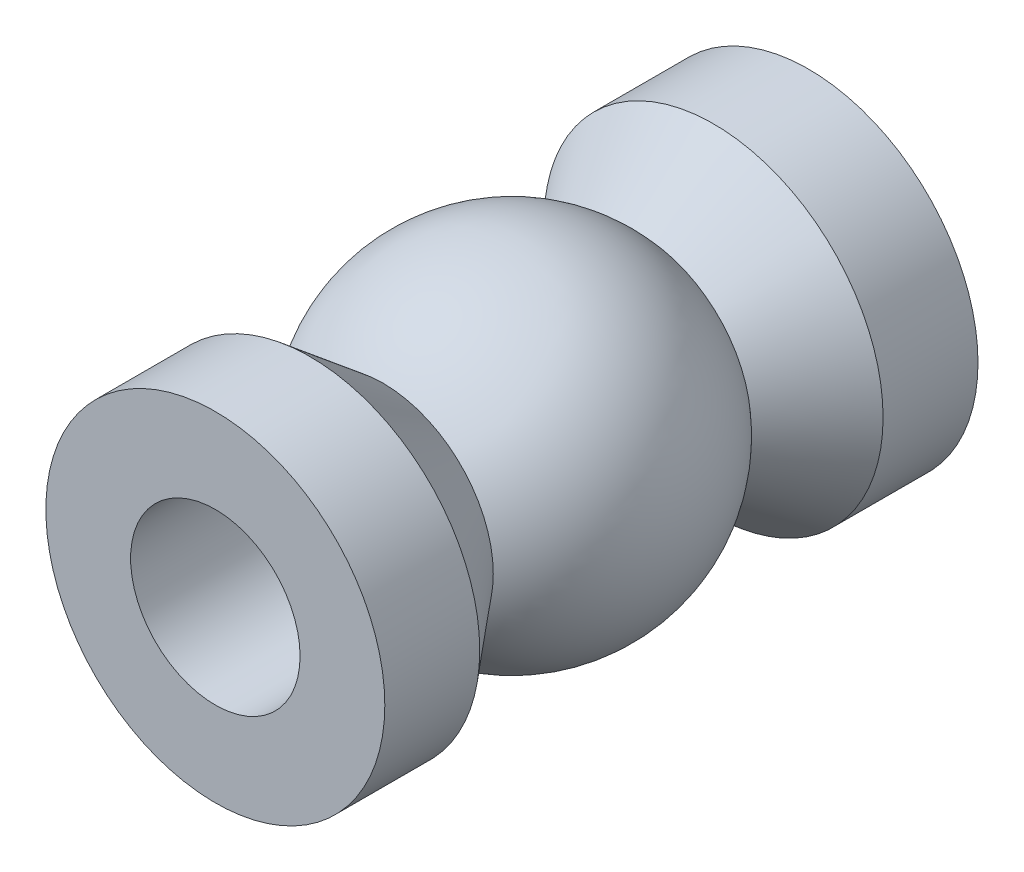
ISO-10303-21;
HEADER;
FILE_DESCRIPTION(('STEP AP214'),'2;1');
FILE_NAME('part.step','',(''),(''),'','','');
FILE_SCHEMA(('AUTOMOTIVE_DESIGN { 1 0 10303 214 1 1 1 1 }'));
ENDSEC;
DATA;
#1=APPLICATION_CONTEXT('core data for automotive mechanical design processes');
#2=APPLICATION_PROTOCOL_DEFINITION('international standard','automotive_design',2000,#1);
#3=PRODUCT_CONTEXT('',#1,'mechanical');
#4=PRODUCT('Part','Part','',(#3));
#5=PRODUCT_RELATED_PRODUCT_CATEGORY('part','',(#4));
#6=PRODUCT_DEFINITION_FORMATION('','',#4);
#7=PRODUCT_DEFINITION_CONTEXT('part definition',#1,'design');
#8=PRODUCT_DEFINITION('design','',#6,#7);
#9=PRODUCT_DEFINITION_SHAPE('','',#8);
#10=(LENGTH_UNIT() NAMED_UNIT(*) SI_UNIT(.MILLI.,.METRE.));
#11=(NAMED_UNIT(*) PLANE_ANGLE_UNIT() SI_UNIT($,.RADIAN.));
#12=(NAMED_UNIT(*) SI_UNIT($,.STERADIAN.) SOLID_ANGLE_UNIT());
#13=UNCERTAINTY_MEASURE_WITH_UNIT(LENGTH_MEASURE(1.E-05),#10,'distance_accuracy_value','');
#14=(GEOMETRIC_REPRESENTATION_CONTEXT(3) GLOBAL_UNCERTAINTY_ASSIGNED_CONTEXT((#13)) GLOBAL_UNIT_ASSIGNED_CONTEXT((#10,
#11,#12)) REPRESENTATION_CONTEXT('',''));
#15=CARTESIAN_POINT('',(0.,0.,0.));
#16=DIRECTION('',(0.,0.,1.));
#17=DIRECTION('',(1.,0.,0.));
#18=AXIS2_PLACEMENT_3D('',#15,#16,#17);
#19=CARTESIAN_POINT('',(0.,-3.175,11.1125));
#20=DIRECTION('',(0.,0.,1.));
#21=DIRECTION('',(1.,0.,0.));
#22=AXIS2_PLACEMENT_3D('',#19,#20,#21);
#23=PLANE('',#22);
#24=CARTESIAN_POINT('',(0.,0.,11.1125));
#25=DIRECTION('',(0.,0.,1.));
#26=DIRECTION('',(1.,0.,0.));
#27=AXIS2_PLACEMENT_3D('',#24,#25,#26);
#28=CIRCLE('',#27,6.35);
#29=CARTESIAN_POINT('',(6.35,0.,11.1125));
#30=VERTEX_POINT('',#29);
#31=EDGE_CURVE('E11',#30,#30,#28,.T.);
#32=ORIENTED_EDGE('',*,*,#31,.T.);
#33=EDGE_LOOP('',(#32));
#34=FACE_BOUND('',#33,.T.);
#35=CARTESIAN_POINT('',(0.,0.,11.1125));
#36=DIRECTION('',(0.,0.,1.));
#37=DIRECTION('',(1.,0.,0.));
#38=AXIS2_PLACEMENT_3D('',#35,#36,#37);
#39=CIRCLE('',#38,3.175);
#40=CARTESIAN_POINT('',(3.175,0.,11.1125));
#41=VERTEX_POINT('',#40);
#42=EDGE_CURVE('E67',#41,#41,#39,.T.);
#43=ORIENTED_EDGE('',*,*,#42,.F.);
#44=EDGE_LOOP('',(#43));
#45=FACE_BOUND('',#44,.T.);
#46=ADVANCED_FACE('F39',(#34,#45),#23,.T.);
#47=CARTESIAN_POINT('',(0.,0.,-0.0693447737909496));
#48=DIRECTION('',(0.,0.,1.));
#49=DIRECTION('',(1.,0.,0.));
#50=AXIS2_PLACEMENT_3D('',#47,#48,#49);
#51=CYLINDRICAL_SURFACE('',#50,6.35);
#52=CARTESIAN_POINT('',(0.,0.,7.5565));
#53=DIRECTION('',(0.,0.,1.));
#54=DIRECTION('',(1.,0.,0.));
#55=AXIS2_PLACEMENT_3D('',#52,#53,#54);
#56=CIRCLE('',#55,6.35);
#57=CARTESIAN_POINT('',(6.35,0.,7.5565));
#58=VERTEX_POINT('',#57);
#59=EDGE_CURVE('E44',#58,#58,#56,.T.);
#60=ORIENTED_EDGE('',*,*,#59,.T.);
#61=EDGE_LOOP('',(#60));
#62=FACE_BOUND('',#61,.T.);
#63=ORIENTED_EDGE('',*,*,#31,.F.);
#64=EDGE_LOOP('',(#63));
#65=FACE_BOUND('',#64,.T.);
#66=ADVANCED_FACE('F75',(#62,#65),#51,.T.);
#67=CARTESIAN_POINT('',(0.,0.,7.5565));
#68=DIRECTION('',(0.,0.,1.));
#69=DIRECTION('',(1.,0.,0.));
#70=AXIS2_PLACEMENT_3D('',#67,#68,#69);
#71=CONICAL_SURFACE('',#70,6.35,0.683299044455203);
#72=CARTESIAN_POINT('',(0.,0.,4.826));
#73=DIRECTION('',(0.,0.,1.));
#74=DIRECTION('',(1.,0.,0.));
#75=AXIS2_PLACEMENT_3D('',#72,#73,#74);
#76=CIRCLE('',#75,4.12701150955507);
#77=CARTESIAN_POINT('',(0.,-4.12701150955507,4.826));
#78=VERTEX_POINT('',#77);
#79=EDGE_CURVE('E48',#78,#78,#76,.T.);
#80=ORIENTED_EDGE('',*,*,#79,.T.);
#81=EDGE_LOOP('',(#80));
#82=FACE_BOUND('',#81,.T.);
#83=ORIENTED_EDGE('',*,*,#59,.F.);
#84=EDGE_LOOP('',(#83));
#85=FACE_BOUND('',#84,.T.);
#86=ADVANCED_FACE('F79',(#82,#85),#71,.T.);
#87=CARTESIAN_POINT('',(0.,0.,0.));
#88=DIRECTION('',(0.,0.,1.));
#89=DIRECTION('',(0.,-1.,0.));
#90=AXIS2_PLACEMENT_3D('',#87,#88,#89);
#91=SPHERICAL_SURFACE('',#90,6.35);
#92=CARTESIAN_POINT('',(0.,0.,-4.826));
#93=DIRECTION('',(0.,0.,1.));
#94=DIRECTION('',(1.,0.,0.));
#95=AXIS2_PLACEMENT_3D('',#92,#93,#94);
#96=CIRCLE('',#95,4.12701150955507);
#97=CARTESIAN_POINT('',(0.,-4.12701150955507,-4.826));
#98=VERTEX_POINT('',#97);
#99=EDGE_CURVE('E52',#98,#98,#96,.T.);
#100=CARTESIAN_POINT('',(0.,-4.12701150955507,-4.826));
#101=CARTESIAN_POINT('',(0.,-4.21381266759285,-4.75177518611277));
#102=CARTESIAN_POINT('',(0.,-4.29860695020054,-4.67520405698828));
#103=CARTESIAN_POINT('',(0.,-4.46394471529104,-4.51760227783629));
#104=CARTESIAN_POINT('',(0.,-4.54448819777385,-4.43657162780879));
#105=CARTESIAN_POINT('',(0.,-4.70108731334996,-4.2702839164223));
#106=CARTESIAN_POINT('',(0.,-4.77714294644324,-4.1850268550633));
#107=CARTESIAN_POINT('',(0.,-4.92454569181152,-4.01053521024732));
#108=CARTESIAN_POINT('',(0.,-4.99589280408652,-3.92130062679033));
#109=CARTESIAN_POINT('',(0.,-5.13367065297356,-3.73911347229029));
#110=CARTESIAN_POINT('',(0.,-5.2001013895856,-3.64616090124723));
#111=CARTESIAN_POINT('',(0.,-5.32785318021889,-3.45680837759192));
#112=CARTESIAN_POINT('',(0.,-5.38917423424014,-3.36040842497966));
#113=CARTESIAN_POINT('',(0.,-5.50652816152999,-3.16444171144563));
#114=CARTESIAN_POINT('',(0.,-5.56256103479859,-3.06487495052385));
#115=CARTESIAN_POINT('',(0.,-5.66917551160203,-2.86286442905827));
#116=CARTESIAN_POINT('',(0.,-5.71975711513687,-2.76042066851448));
#117=CARTESIAN_POINT('',(0.,-5.81532182570048,-2.5529543256536));
#118=CARTESIAN_POINT('',(0.,-5.86030493272924,-2.44793174333653));
#119=CARTESIAN_POINT('',(0.,-5.94454172005013,-2.2356134421361));
#120=CARTESIAN_POINT('',(0.,-5.98379540034225,-2.12831772325274));
#121=CARTESIAN_POINT('',(0.,-6.05645908003861,-1.91176545010749));
#122=CARTESIAN_POINT('',(0.,-6.08986907944285,-1.80250889584559));
#123=CARTESIAN_POINT('',(0.,-6.15074815226325,-1.58235296054673));
#124=CARTESIAN_POINT('',(0.,-6.1782172256794,-1.47145357950977));
#125=CARTESIAN_POINT('',(0.,-6.22713449341011,-1.24833478094822));
#126=CARTESIAN_POINT('',(0.,-6.24858268772467,-1.13611536342363));
#127=CARTESIAN_POINT('',(0.,-6.28539576887156,-0.910683124357101));
#128=CARTESIAN_POINT('',(0.,-6.30076065570389,-0.797470302815158));
#129=CARTESIAN_POINT('',(0.,-6.32536239993827,-0.570380779642863));
#130=CARTESIAN_POINT('',(0.,-6.33459925734032,-0.456504078012511));
#131=CARTESIAN_POINT('',(0.,-6.34691805737119,-0.228418250921439));
#132=CARTESIAN_POINT('',(0.,-6.35,-0.114209125460719));
#133=CARTESIAN_POINT('',(0.,-6.35,0.114209125460721));
#134=CARTESIAN_POINT('',(0.,-6.34691805737118,0.228418250921441));
#135=CARTESIAN_POINT('',(0.,-6.33459925734032,0.456504078012512));
#136=CARTESIAN_POINT('',(0.,-6.32536239993827,0.570380779642864));
#137=CARTESIAN_POINT('',(0.,-6.30076065570389,0.797470302815159));
#138=CARTESIAN_POINT('',(0.,-6.28539576887156,0.910683124357102));
#139=CARTESIAN_POINT('',(0.,-6.24858268772467,1.13611536342364));
#140=CARTESIAN_POINT('',(0.,-6.22713449341011,1.24833478094823));
#141=CARTESIAN_POINT('',(0.,-6.1782172256794,1.47145357950978));
#142=CARTESIAN_POINT('',(0.,-6.15074815226325,1.58235296054673));
#143=CARTESIAN_POINT('',(0.,-6.08986907944285,1.80250889584559));
#144=CARTESIAN_POINT('',(0.,-6.05645908003861,1.91176545010749));
#145=CARTESIAN_POINT('',(0.,-5.98379540034225,2.12831772325275));
#146=CARTESIAN_POINT('',(0.,-5.94454172005013,2.2356134421361));
#147=CARTESIAN_POINT('',(0.,-5.86030493272924,2.44793174333653));
#148=CARTESIAN_POINT('',(0.,-5.81532182570048,2.5529543256536));
#149=CARTESIAN_POINT('',(0.,-5.71975711513687,2.76042066851448));
#150=CARTESIAN_POINT('',(0.,-5.66917551160203,2.86286442905827));
#151=CARTESIAN_POINT('',(0.,-5.56256103479859,3.06487495052385));
#152=CARTESIAN_POINT('',(0.,-5.50652816152999,3.16444171144563));
#153=CARTESIAN_POINT('',(0.,-5.38917423424014,3.36040842497966));
#154=CARTESIAN_POINT('',(0.,-5.32785318021889,3.45680837759192));
#155=CARTESIAN_POINT('',(0.,-5.2001013895856,3.64616090124723));
#156=CARTESIAN_POINT('',(0.,-5.13367065297356,3.73911347229029));
#157=CARTESIAN_POINT('',(0.,-4.99589280408652,3.92130062679033));
#158=CARTESIAN_POINT('',(0.,-4.92454569181152,4.01053521024732));
#159=CARTESIAN_POINT('',(0.,-4.77714294644324,4.1850268550633));
#160=CARTESIAN_POINT('',(0.,-4.70108731334996,4.2702839164223));
#161=CARTESIAN_POINT('',(0.,-4.54448819777385,4.43657162780879));
#162=CARTESIAN_POINT('',(0.,-4.46394471529104,4.51760227783629));
#163=CARTESIAN_POINT('',(0.,-4.29860695020054,4.67520405698828));
#164=CARTESIAN_POINT('',(0.,-4.21381266759285,4.75177518611277));
#165=CARTESIAN_POINT('',(0.,-4.12701150955507,4.826));
#166=B_SPLINE_CURVE_WITH_KNOTS('',3,(#100,#101,#102,#103,#104,#105,#106,#107,#108,#109,#110,
#111,#112,#113,#114,#115,#116,#117,#118,#119,#120,#121,#122,#123,#124,#125,#126,#127,#128,#129,
#130,#131,#132,#133,#134,#135,#136,#137,#138,#139,#140,#141,#142,#143,#144,#145,#146,#147,#148,
#149,#150,#151,#152,#153,#154,#155,#156,#157,#158,#159,#160,#161,#162,#163,#164,#165),
.UNSPECIFIED.,.F.,.F.,(4,2,2,2,2,2,2,2,2,2,2,2,2,2,2,2,2,2,2,2,2,2,2,2,2,2,2,2,2,2,2,2,4),(0.,
0.342585830970788,0.685171661941576,1.02775749291236,1.37034332388315,1.71292915485394,
2.05551498582473,2.39810081679552,2.7406866477663,3.08327247873709,3.42585830970788,
3.76844414067867,4.11102997164946,4.45361580262025,4.79620163359103,5.13878746456182,
5.48137329553261,5.8239591265034,6.16654495747419,6.50913078844497,6.85171661941576,
7.19430245038655,7.53688828135734,7.87947411232813,8.22205994329891,8.5646457742697,
8.90723160524049,9.24981743621128,9.59240326718206,9.93498909815285,10.2775749291236,
10.6201607600944,10.9627465910652),.UNSPECIFIED.);
#167=EDGE_CURVE('BSEAM83',#98,#78,#166,.T.);
#168=ORIENTED_EDGE('',*,*,#99,.T.);
#169=ORIENTED_EDGE('',*,*,#79,.F.);
#170=ORIENTED_EDGE('',*,*,#167,.T.);
#171=ORIENTED_EDGE('',*,*,#167,.F.);
#172=EDGE_LOOP('',(#168,#170,#169,#171));
#173=FACE_BOUND('',#172,.T.);
#174=ADVANCED_FACE('F83',(#173),#91,.T.);
#175=CARTESIAN_POINT('',(0.,0.,-4.826));
#176=DIRECTION('',(0.,0.,-1.));
#177=DIRECTION('',(-1.,0.,0.));
#178=AXIS2_PLACEMENT_3D('',#175,#176,#177);
#179=CONICAL_SURFACE('',#178,4.12701150955507,0.683299044455202);
#180=CARTESIAN_POINT('',(0.,0.,-7.5565));
#181=DIRECTION('',(0.,0.,1.));
#182=DIRECTION('',(1.,0.,0.));
#183=AXIS2_PLACEMENT_3D('',#180,#181,#182);
#184=CIRCLE('',#183,6.35);
#185=CARTESIAN_POINT('',(6.35,0.,-7.5565));
#186=VERTEX_POINT('',#185);
#187=EDGE_CURVE('E58',#186,#186,#184,.T.);
#188=ORIENTED_EDGE('',*,*,#187,.T.);
#189=EDGE_LOOP('',(#188));
#190=FACE_BOUND('',#189,.T.);
#191=ORIENTED_EDGE('',*,*,#99,.F.);
#192=EDGE_LOOP('',(#191));
#193=FACE_BOUND('',#192,.T.);
#194=ADVANCED_FACE('F90',(#190,#193),#179,.T.);
#195=CARTESIAN_POINT('',(0.,0.,-0.0693447737909496));
#196=DIRECTION('',(0.,0.,1.));
#197=DIRECTION('',(1.,0.,0.));
#198=AXIS2_PLACEMENT_3D('',#195,#196,#197);
#199=CYLINDRICAL_SURFACE('',#198,6.35);
#200=CARTESIAN_POINT('',(0.,0.,-11.1125));
#201=DIRECTION('',(0.,0.,1.));
#202=DIRECTION('',(1.,0.,0.));
#203=AXIS2_PLACEMENT_3D('',#200,#201,#202);
#204=CIRCLE('',#203,6.35);
#205=CARTESIAN_POINT('',(6.35,0.,-11.1125));
#206=VERTEX_POINT('',#205);
#207=EDGE_CURVE('E61',#206,#206,#204,.T.);
#208=ORIENTED_EDGE('',*,*,#207,.T.);
#209=EDGE_LOOP('',(#208));
#210=FACE_BOUND('',#209,.T.);
#211=ORIENTED_EDGE('',*,*,#187,.F.);
#212=EDGE_LOOP('',(#211));
#213=FACE_BOUND('',#212,.T.);
#214=ADVANCED_FACE('F94',(#210,#213),#199,.T.);
#215=CARTESIAN_POINT('',(0.,-3.175,-11.1125));
#216=DIRECTION('',(0.,0.,-1.));
#217=DIRECTION('',(-1.,0.,0.));
#218=AXIS2_PLACEMENT_3D('',#215,#216,#217);
#219=PLANE('',#218);
#220=CARTESIAN_POINT('',(0.,0.,-11.1125));
#221=DIRECTION('',(0.,0.,1.));
#222=DIRECTION('',(1.,0.,0.));
#223=AXIS2_PLACEMENT_3D('',#220,#221,#222);
#224=CIRCLE('',#223,3.175);
#225=CARTESIAN_POINT('',(3.175,0.,-11.1125));
#226=VERTEX_POINT('',#225);
#227=EDGE_CURVE('E64',#226,#226,#224,.T.);
#228=ORIENTED_EDGE('',*,*,#227,.T.);
#229=EDGE_LOOP('',(#228));
#230=FACE_BOUND('',#229,.T.);
#231=ORIENTED_EDGE('',*,*,#207,.F.);
#232=EDGE_LOOP('',(#231));
#233=FACE_BOUND('',#232,.T.);
#234=ADVANCED_FACE('F98',(#230,#233),#219,.T.);
#235=CARTESIAN_POINT('',(0.,0.,-0.0693447737909496));
#236=DIRECTION('',(0.,0.,1.));
#237=DIRECTION('',(1.,0.,0.));
#238=AXIS2_PLACEMENT_3D('',#235,#236,#237);
#239=CYLINDRICAL_SURFACE('',#238,3.175);
#240=ORIENTED_EDGE('',*,*,#42,.T.);
#241=EDGE_LOOP('',(#240));
#242=FACE_BOUND('',#241,.T.);
#243=ORIENTED_EDGE('',*,*,#227,.F.);
#244=EDGE_LOOP('',(#243));
#245=FACE_BOUND('',#244,.T.);
#246=ADVANCED_FACE('F71',(#242,#245),#239,.F.);
#247=CLOSED_SHELL('',(#46,#66,#86,#174,#194,#214,#234,#246));
#248=MANIFOLD_SOLID_BREP('B2',#247);
#249=ADVANCED_BREP_SHAPE_REPRESENTATION('',(#18,#248),#14);
#250=SHAPE_DEFINITION_REPRESENTATION(#9,#249);
ENDSEC;
END-ISO-10303-21;
